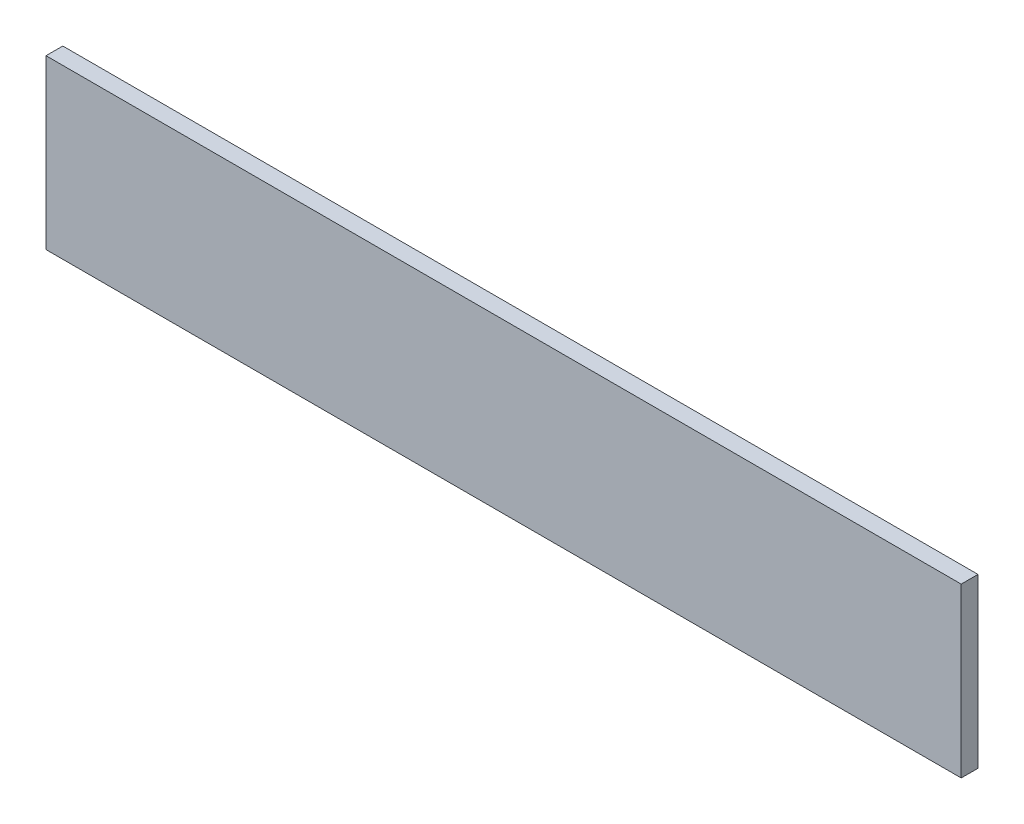
ISO-10303-21;
HEADER;
FILE_DESCRIPTION(('STEP AP214'),'2;1');
FILE_NAME('part.step','',(''),(''),'','','');
FILE_SCHEMA(('AUTOMOTIVE_DESIGN { 1 0 10303 214 1 1 1 1 }'));
ENDSEC;
DATA;
#1=APPLICATION_CONTEXT('core data for automotive mechanical design processes');
#2=APPLICATION_PROTOCOL_DEFINITION('international standard','automotive_design',2000,#1);
#3=PRODUCT_CONTEXT('',#1,'mechanical');
#4=PRODUCT('Part','Part','',(#3));
#5=PRODUCT_RELATED_PRODUCT_CATEGORY('part','',(#4));
#6=PRODUCT_DEFINITION_FORMATION('','',#4);
#7=PRODUCT_DEFINITION_CONTEXT('part definition',#1,'design');
#8=PRODUCT_DEFINITION('design','',#6,#7);
#9=PRODUCT_DEFINITION_SHAPE('','',#8);
#10=(LENGTH_UNIT() NAMED_UNIT(*) SI_UNIT(.MILLI.,.METRE.));
#11=(NAMED_UNIT(*) PLANE_ANGLE_UNIT() SI_UNIT($,.RADIAN.));
#12=(NAMED_UNIT(*) SI_UNIT($,.STERADIAN.) SOLID_ANGLE_UNIT());
#13=UNCERTAINTY_MEASURE_WITH_UNIT(LENGTH_MEASURE(1.E-05),#10,'distance_accuracy_value','');
#14=(GEOMETRIC_REPRESENTATION_CONTEXT(3) GLOBAL_UNCERTAINTY_ASSIGNED_CONTEXT((#13)) GLOBAL_UNIT_ASSIGNED_CONTEXT((#10,
#11,#12)) REPRESENTATION_CONTEXT('',''));
#15=CARTESIAN_POINT('',(0.,0.,0.));
#16=DIRECTION('',(0.,0.,1.));
#17=DIRECTION('',(1.,0.,0.));
#18=AXIS2_PLACEMENT_3D('',#15,#16,#17);
#19=CARTESIAN_POINT('',(0.,0.,2.));
#20=DIRECTION('',(1.,0.,0.));
#21=DIRECTION('',(0.,1.,0.));
#22=AXIS2_PLACEMENT_3D('',#19,#20,#21);
#23=PLANE('',#22);
#24=DIRECTION('',(0.,-1.,0.));
#25=VECTOR('',#24,1.);
#26=CARTESIAN_POINT('',(0.,0.,0.));
#27=LINE('',#26,#25);
#28=CARTESIAN_POINT('',(0.,0.,0.));
#29=VERTEX_POINT('',#28);
#30=CARTESIAN_POINT('',(0.,-20.,0.));
#31=VERTEX_POINT('',#30);
#32=EDGE_CURVE('E114',#29,#31,#27,.T.);
#33=ORIENTED_EDGE('',*,*,#32,.T.);
#34=DIRECTION('',(0.,0.,-1.));
#35=VECTOR('',#34,1.);
#36=CARTESIAN_POINT('',(0.,-20.,2.));
#37=LINE('',#36,#35);
#38=CARTESIAN_POINT('',(0.,-20.,2.));
#39=VERTEX_POINT('',#38);
#40=EDGE_CURVE('E11',#39,#31,#37,.T.);
#41=ORIENTED_EDGE('',*,*,#40,.F.);
#42=DIRECTION('',(0.,-1.,0.));
#43=VECTOR('',#42,1.);
#44=CARTESIAN_POINT('',(0.,0.,2.));
#45=LINE('',#44,#43);
#46=CARTESIAN_POINT('',(0.,0.,2.));
#47=VERTEX_POINT('',#46);
#48=EDGE_CURVE('E100',#47,#39,#45,.T.);
#49=ORIENTED_EDGE('',*,*,#48,.F.);
#50=DIRECTION('',(0.,0.,-1.));
#51=VECTOR('',#50,1.);
#52=CARTESIAN_POINT('',(0.,0.,2.));
#53=LINE('',#52,#51);
#54=EDGE_CURVE('E108',#47,#29,#53,.T.);
#55=ORIENTED_EDGE('',*,*,#54,.T.);
#56=EDGE_LOOP('',(#33,#41,#49,#55));
#57=FACE_BOUND('',#56,.T.);
#58=ADVANCED_FACE('F44',(#57),#23,.F.);
#59=CARTESIAN_POINT('',(0.,-20.,2.));
#60=DIRECTION('',(0.,1.,0.));
#61=DIRECTION('',(0.,0.,1.));
#62=AXIS2_PLACEMENT_3D('',#59,#60,#61);
#63=PLANE('',#62);
#64=DIRECTION('',(1.,0.,0.));
#65=VECTOR('',#64,1.);
#66=CARTESIAN_POINT('',(0.,-20.,0.));
#67=LINE('',#66,#65);
#68=CARTESIAN_POINT('',(109.,-20.,0.));
#69=VERTEX_POINT('',#68);
#70=EDGE_CURVE('E105',#31,#69,#67,.T.);
#71=ORIENTED_EDGE('',*,*,#70,.T.);
#72=DIRECTION('',(0.,0.,-1.));
#73=VECTOR('',#72,1.);
#74=CARTESIAN_POINT('',(109.,-20.,2.));
#75=LINE('',#74,#73);
#76=CARTESIAN_POINT('',(109.,-20.,2.));
#77=VERTEX_POINT('',#76);
#78=EDGE_CURVE('E53',#77,#69,#75,.T.);
#79=ORIENTED_EDGE('',*,*,#78,.F.);
#80=DIRECTION('',(1.,0.,0.));
#81=VECTOR('',#80,1.);
#82=CARTESIAN_POINT('',(0.,-20.,2.));
#83=LINE('',#82,#81);
#84=EDGE_CURVE('E95',#39,#77,#83,.T.);
#85=ORIENTED_EDGE('',*,*,#84,.F.);
#86=ORIENTED_EDGE('',*,*,#40,.T.);
#87=EDGE_LOOP('',(#71,#79,#85,#86));
#88=FACE_BOUND('',#87,.T.);
#89=ADVANCED_FACE('F101',(#88),#63,.F.);
#90=CARTESIAN_POINT('',(109.,0.,2.));
#91=DIRECTION('',(-1.,0.,0.));
#92=DIRECTION('',(0.,0.,1.));
#93=AXIS2_PLACEMENT_3D('',#90,#91,#92);
#94=PLANE('',#93);
#95=DIRECTION('',(0.,1.,0.));
#96=VECTOR('',#95,1.);
#97=CARTESIAN_POINT('',(109.,0.,0.));
#98=LINE('',#97,#96);
#99=CARTESIAN_POINT('',(109.,0.,0.));
#100=VERTEX_POINT('',#99);
#101=EDGE_CURVE('E76',#69,#100,#98,.T.);
#102=ORIENTED_EDGE('',*,*,#101,.T.);
#103=DIRECTION('',(0.,0.,-1.));
#104=VECTOR('',#103,1.);
#105=CARTESIAN_POINT('',(109.,0.,2.));
#106=LINE('',#105,#104);
#107=CARTESIAN_POINT('',(109.,0.,2.));
#108=VERTEX_POINT('',#107);
#109=EDGE_CURVE('E102',#108,#100,#106,.T.);
#110=ORIENTED_EDGE('',*,*,#109,.F.);
#111=DIRECTION('',(0.,1.,0.));
#112=VECTOR('',#111,1.);
#113=CARTESIAN_POINT('',(109.,0.,2.));
#114=LINE('',#113,#112);
#115=EDGE_CURVE('E92',#77,#108,#114,.T.);
#116=ORIENTED_EDGE('',*,*,#115,.F.);
#117=ORIENTED_EDGE('',*,*,#78,.T.);
#118=EDGE_LOOP('',(#102,#110,#116,#117));
#119=FACE_BOUND('',#118,.T.);
#120=ADVANCED_FACE('F104',(#119),#94,.F.);
#121=CARTESIAN_POINT('',(0.,0.,2.));
#122=DIRECTION('',(0.,-1.,0.));
#123=DIRECTION('',(0.,0.,-1.));
#124=AXIS2_PLACEMENT_3D('',#121,#122,#123);
#125=PLANE('',#124);
#126=DIRECTION('',(-1.,0.,0.));
#127=VECTOR('',#126,1.);
#128=CARTESIAN_POINT('',(0.,0.,0.));
#129=LINE('',#128,#127);
#130=EDGE_CURVE('E84',#100,#29,#129,.T.);
#131=ORIENTED_EDGE('',*,*,#130,.T.);
#132=ORIENTED_EDGE('',*,*,#54,.F.);
#133=DIRECTION('',(-1.,0.,0.));
#134=VECTOR('',#133,1.);
#135=CARTESIAN_POINT('',(0.,0.,2.));
#136=LINE('',#135,#134);
#137=EDGE_CURVE('E65',#108,#47,#136,.T.);
#138=ORIENTED_EDGE('',*,*,#137,.F.);
#139=ORIENTED_EDGE('',*,*,#109,.T.);
#140=EDGE_LOOP('',(#131,#132,#138,#139));
#141=FACE_BOUND('',#140,.T.);
#142=ADVANCED_FACE('F127',(#141),#125,.F.);
#143=CARTESIAN_POINT('',(0.,0.,2.));
#144=DIRECTION('',(0.,0.,1.));
#145=DIRECTION('',(1.,0.,0.));
#146=AXIS2_PLACEMENT_3D('',#143,#144,#145);
#147=PLANE('',#146);
#148=ORIENTED_EDGE('',*,*,#48,.T.);
#149=ORIENTED_EDGE('',*,*,#84,.T.);
#150=ORIENTED_EDGE('',*,*,#115,.T.);
#151=ORIENTED_EDGE('',*,*,#137,.T.);
#152=EDGE_LOOP('',(#148,#149,#150,#151));
#153=FACE_BOUND('',#152,.T.);
#154=ADVANCED_FACE('F91',(#153),#147,.T.);
#155=CARTESIAN_POINT('',(0.,0.,0.));
#156=DIRECTION('',(0.,0.,1.));
#157=DIRECTION('',(1.,0.,0.));
#158=AXIS2_PLACEMENT_3D('',#155,#156,#157);
#159=PLANE('',#158);
#160=ORIENTED_EDGE('',*,*,#32,.F.);
#161=ORIENTED_EDGE('',*,*,#130,.F.);
#162=ORIENTED_EDGE('',*,*,#101,.F.);
#163=ORIENTED_EDGE('',*,*,#70,.F.);
#164=EDGE_LOOP('',(#160,#161,#162,#163));
#165=FACE_BOUND('',#164,.T.);
#166=ADVANCED_FACE('F129',(#165),#159,.F.);
#167=CLOSED_SHELL('',(#58,#89,#120,#142,#154,#166));
#168=MANIFOLD_SOLID_BREP('B2',#167);
#169=ADVANCED_BREP_SHAPE_REPRESENTATION('',(#18,#168),#14);
#170=SHAPE_DEFINITION_REPRESENTATION(#9,#169);
ENDSEC;
END-ISO-10303-21;
